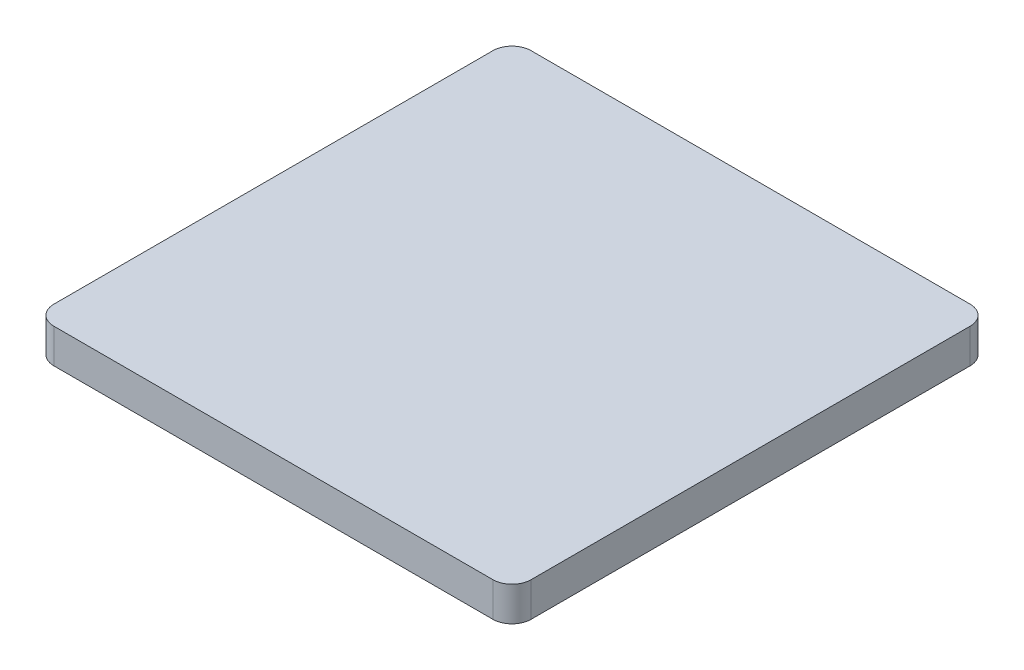
ISO-10303-21;
HEADER;
FILE_DESCRIPTION(('STEP AP214'),'2;1');
FILE_NAME('part.step','',(''),(''),'','','');
FILE_SCHEMA(('AUTOMOTIVE_DESIGN { 1 0 10303 214 1 1 1 1 }'));
ENDSEC;
DATA;
#1=APPLICATION_CONTEXT('core data for automotive mechanical design processes');
#2=APPLICATION_PROTOCOL_DEFINITION('international standard','automotive_design',2000,#1);
#3=PRODUCT_CONTEXT('',#1,'mechanical');
#4=PRODUCT('Part','Part','',(#3));
#5=PRODUCT_RELATED_PRODUCT_CATEGORY('part','',(#4));
#6=PRODUCT_DEFINITION_FORMATION('','',#4);
#7=PRODUCT_DEFINITION_CONTEXT('part definition',#1,'design');
#8=PRODUCT_DEFINITION('design','',#6,#7);
#9=PRODUCT_DEFINITION_SHAPE('','',#8);
#10=(LENGTH_UNIT() NAMED_UNIT(*) SI_UNIT(.MILLI.,.METRE.));
#11=(NAMED_UNIT(*) PLANE_ANGLE_UNIT() SI_UNIT($,.RADIAN.));
#12=(NAMED_UNIT(*) SI_UNIT($,.STERADIAN.) SOLID_ANGLE_UNIT());
#13=UNCERTAINTY_MEASURE_WITH_UNIT(LENGTH_MEASURE(1.E-05),#10,'distance_accuracy_value','');
#14=(GEOMETRIC_REPRESENTATION_CONTEXT(3) GLOBAL_UNCERTAINTY_ASSIGNED_CONTEXT((#13)) GLOBAL_UNIT_ASSIGNED_CONTEXT((#10,
#11,#12)) REPRESENTATION_CONTEXT('',''));
#15=CARTESIAN_POINT('',(0.,0.,0.));
#16=DIRECTION('',(0.,0.,1.));
#17=DIRECTION('',(1.,0.,0.));
#18=AXIS2_PLACEMENT_3D('',#15,#16,#17);
#19=CARTESIAN_POINT('',(-125.,18.,125.));
#20=DIRECTION('',(1.,0.,0.));
#21=DIRECTION('',(0.,0.,-1.));
#22=AXIS2_PLACEMENT_3D('',#19,#20,#21);
#23=PLANE('',#22);
#24=DIRECTION('',(0.,0.,1.));
#25=VECTOR('',#24,1.);
#26=CARTESIAN_POINT('',(-125.,18.,125.));
#27=LINE('',#26,#25);
#28=CARTESIAN_POINT('',(-125.,18.,-115.));
#29=VERTEX_POINT('',#28);
#30=CARTESIAN_POINT('',(-125.,18.,115.));
#31=VERTEX_POINT('',#30);
#32=EDGE_CURVE('E122',#29,#31,#27,.T.);
#33=ORIENTED_EDGE('',*,*,#32,.F.);
#34=DIRECTION('',(0.,-1.,0.));
#35=VECTOR('',#34,1.);
#36=CARTESIAN_POINT('',(-125.,18.,-115.));
#37=LINE('',#36,#35);
#38=CARTESIAN_POINT('',(-125.,0.,-115.));
#39=VERTEX_POINT('',#38);
#40=EDGE_CURVE('E107',#29,#39,#37,.T.);
#41=ORIENTED_EDGE('',*,*,#40,.T.);
#42=DIRECTION('',(0.,0.,1.));
#43=VECTOR('',#42,1.);
#44=CARTESIAN_POINT('',(-125.,0.,125.));
#45=LINE('',#44,#43);
#46=CARTESIAN_POINT('',(-125.,0.,115.));
#47=VERTEX_POINT('',#46);
#48=EDGE_CURVE('E119',#39,#47,#45,.T.);
#49=ORIENTED_EDGE('',*,*,#48,.T.);
#50=DIRECTION('',(0.,-1.,0.));
#51=VECTOR('',#50,1.);
#52=CARTESIAN_POINT('',(-125.,18.,115.));
#53=LINE('',#52,#51);
#54=EDGE_CURVE('E124',#47,#31,#53,.F.);
#55=ORIENTED_EDGE('',*,*,#54,.T.);
#56=EDGE_LOOP('',(#33,#41,#49,#55));
#57=FACE_BOUND('',#56,.T.);
#58=ADVANCED_FACE('F37',(#57),#23,.F.);
#59=CARTESIAN_POINT('',(-125.,18.,125.));
#60=DIRECTION('',(0.,0.,-1.));
#61=DIRECTION('',(-1.,0.,0.));
#62=AXIS2_PLACEMENT_3D('',#59,#60,#61);
#63=PLANE('',#62);
#64=DIRECTION('',(1.,0.,0.));
#65=VECTOR('',#64,1.);
#66=CARTESIAN_POINT('',(-125.,0.,125.));
#67=LINE('',#66,#65);
#68=CARTESIAN_POINT('',(-115.,0.,125.));
#69=VERTEX_POINT('',#68);
#70=CARTESIAN_POINT('',(115.,0.,125.));
#71=VERTEX_POINT('',#70);
#72=EDGE_CURVE('E128',#69,#71,#67,.T.);
#73=ORIENTED_EDGE('',*,*,#72,.T.);
#74=DIRECTION('',(0.,-1.,0.));
#75=VECTOR('',#74,1.);
#76=CARTESIAN_POINT('',(115.,18.,125.));
#77=LINE('',#76,#75);
#78=CARTESIAN_POINT('',(115.,18.,125.));
#79=VERTEX_POINT('',#78);
#80=EDGE_CURVE('E11',#71,#79,#77,.F.);
#81=ORIENTED_EDGE('',*,*,#80,.T.);
#82=DIRECTION('',(1.,0.,0.));
#83=VECTOR('',#82,1.);
#84=CARTESIAN_POINT('',(-125.,18.,125.));
#85=LINE('',#84,#83);
#86=CARTESIAN_POINT('',(-115.,18.,125.));
#87=VERTEX_POINT('',#86);
#88=EDGE_CURVE('E164',#87,#79,#85,.T.);
#89=ORIENTED_EDGE('',*,*,#88,.F.);
#90=DIRECTION('',(0.,-1.,0.));
#91=VECTOR('',#90,1.);
#92=CARTESIAN_POINT('',(-115.,18.,125.));
#93=LINE('',#92,#91);
#94=EDGE_CURVE('E45',#87,#69,#93,.T.);
#95=ORIENTED_EDGE('',*,*,#94,.T.);
#96=EDGE_LOOP('',(#73,#81,#89,#95));
#97=FACE_BOUND('',#96,.T.);
#98=ADVANCED_FACE('F162',(#97),#63,.F.);
#99=CARTESIAN_POINT('',(125.,18.,125.));
#100=DIRECTION('',(-1.,0.,0.));
#101=DIRECTION('',(0.,0.,1.));
#102=AXIS2_PLACEMENT_3D('',#99,#100,#101);
#103=PLANE('',#102);
#104=DIRECTION('',(0.,0.,-1.));
#105=VECTOR('',#104,1.);
#106=CARTESIAN_POINT('',(125.,0.,125.));
#107=LINE('',#106,#105);
#108=CARTESIAN_POINT('',(125.,0.,115.));
#109=VERTEX_POINT('',#108);
#110=CARTESIAN_POINT('',(125.,0.,-115.));
#111=VERTEX_POINT('',#110);
#112=EDGE_CURVE('E131',#109,#111,#107,.T.);
#113=ORIENTED_EDGE('',*,*,#112,.T.);
#114=DIRECTION('',(0.,-1.,0.));
#115=VECTOR('',#114,1.);
#116=CARTESIAN_POINT('',(125.,18.,-115.));
#117=LINE('',#116,#115);
#118=CARTESIAN_POINT('',(125.,18.,-115.));
#119=VERTEX_POINT('',#118);
#120=EDGE_CURVE('E52',#111,#119,#117,.F.);
#121=ORIENTED_EDGE('',*,*,#120,.T.);
#122=DIRECTION('',(0.,0.,-1.));
#123=VECTOR('',#122,1.);
#124=CARTESIAN_POINT('',(125.,18.,125.));
#125=LINE('',#124,#123);
#126=CARTESIAN_POINT('',(125.,18.,115.));
#127=VERTEX_POINT('',#126);
#128=EDGE_CURVE('E172',#127,#119,#125,.T.);
#129=ORIENTED_EDGE('',*,*,#128,.F.);
#130=DIRECTION('',(0.,-1.,0.));
#131=VECTOR('',#130,1.);
#132=CARTESIAN_POINT('',(125.,18.,115.));
#133=LINE('',#132,#131);
#134=EDGE_CURVE('E155',#127,#109,#133,.T.);
#135=ORIENTED_EDGE('',*,*,#134,.T.);
#136=EDGE_LOOP('',(#113,#121,#129,#135));
#137=FACE_BOUND('',#136,.T.);
#138=ADVANCED_FACE('F171',(#137),#103,.F.);
#139=CARTESIAN_POINT('',(-125.,18.,-125.));
#140=DIRECTION('',(0.,0.,1.));
#141=DIRECTION('',(1.,0.,0.));
#142=AXIS2_PLACEMENT_3D('',#139,#140,#141);
#143=PLANE('',#142);
#144=DIRECTION('',(-1.,0.,0.));
#145=VECTOR('',#144,1.);
#146=CARTESIAN_POINT('',(-125.,0.,-125.));
#147=LINE('',#146,#145);
#148=CARTESIAN_POINT('',(115.,0.,-125.));
#149=VERTEX_POINT('',#148);
#150=CARTESIAN_POINT('',(-115.,0.,-125.));
#151=VERTEX_POINT('',#150);
#152=EDGE_CURVE('E138',#149,#151,#147,.T.);
#153=ORIENTED_EDGE('',*,*,#152,.T.);
#154=DIRECTION('',(0.,-1.,0.));
#155=VECTOR('',#154,1.);
#156=CARTESIAN_POINT('',(-115.,18.,-125.));
#157=LINE('',#156,#155);
#158=CARTESIAN_POINT('',(-115.,18.,-125.));
#159=VERTEX_POINT('',#158);
#160=EDGE_CURVE('E108',#151,#159,#157,.F.);
#161=ORIENTED_EDGE('',*,*,#160,.T.);
#162=DIRECTION('',(-1.,0.,0.));
#163=VECTOR('',#162,1.);
#164=CARTESIAN_POINT('',(-125.,18.,-125.));
#165=LINE('',#164,#163);
#166=CARTESIAN_POINT('',(115.,18.,-125.));
#167=VERTEX_POINT('',#166);
#168=EDGE_CURVE('E134',#167,#159,#165,.T.);
#169=ORIENTED_EDGE('',*,*,#168,.F.);
#170=DIRECTION('',(0.,-1.,0.));
#171=VECTOR('',#170,1.);
#172=CARTESIAN_POINT('',(115.,18.,-125.));
#173=LINE('',#172,#171);
#174=EDGE_CURVE('E113',#167,#149,#173,.T.);
#175=ORIENTED_EDGE('',*,*,#174,.T.);
#176=EDGE_LOOP('',(#153,#161,#169,#175));
#177=FACE_BOUND('',#176,.T.);
#178=ADVANCED_FACE('F200',(#177),#143,.F.);
#179=CARTESIAN_POINT('',(0.,18.,0.));
#180=DIRECTION('',(0.,-1.,0.));
#181=DIRECTION('',(0.,0.,-1.));
#182=AXIS2_PLACEMENT_3D('',#179,#180,#181);
#183=PLANE('',#182);
#184=ORIENTED_EDGE('',*,*,#168,.T.);
#185=CARTESIAN_POINT('',(-115.,18.,-115.));
#186=DIRECTION('',(0.,-1.,0.));
#187=DIRECTION('',(0.,0.,-1.));
#188=AXIS2_PLACEMENT_3D('',#185,#186,#187);
#189=CIRCLE('',#188,10.);
#190=EDGE_CURVE('E153',#159,#29,#189,.F.);
#191=ORIENTED_EDGE('',*,*,#190,.T.);
#192=ORIENTED_EDGE('',*,*,#32,.T.);
#193=CARTESIAN_POINT('',(-115.,18.,115.));
#194=DIRECTION('',(0.,-1.,0.));
#195=DIRECTION('',(0.,0.,-1.));
#196=AXIS2_PLACEMENT_3D('',#193,#194,#195);
#197=CIRCLE('',#196,10.);
#198=EDGE_CURVE('E148',#31,#87,#197,.F.);
#199=ORIENTED_EDGE('',*,*,#198,.T.);
#200=ORIENTED_EDGE('',*,*,#88,.T.);
#201=CARTESIAN_POINT('',(115.,18.,115.));
#202=DIRECTION('',(0.,-1.,0.));
#203=DIRECTION('',(0.,0.,-1.));
#204=AXIS2_PLACEMENT_3D('',#201,#202,#203);
#205=CIRCLE('',#204,10.);
#206=EDGE_CURVE('E59',#79,#127,#205,.F.);
#207=ORIENTED_EDGE('',*,*,#206,.T.);
#208=ORIENTED_EDGE('',*,*,#128,.T.);
#209=CARTESIAN_POINT('',(115.,18.,-115.));
#210=DIRECTION('',(0.,-1.,0.));
#211=DIRECTION('',(0.,0.,-1.));
#212=AXIS2_PLACEMENT_3D('',#209,#210,#211);
#213=CIRCLE('',#212,10.);
#214=EDGE_CURVE('E151',#119,#167,#213,.F.);
#215=ORIENTED_EDGE('',*,*,#214,.T.);
#216=EDGE_LOOP('',(#184,#191,#192,#199,#200,#207,#208,#215));
#217=FACE_BOUND('',#216,.T.);
#218=ADVANCED_FACE('F177',(#217),#183,.F.);
#219=CARTESIAN_POINT('',(0.,0.,0.));
#220=DIRECTION('',(0.,-1.,0.));
#221=DIRECTION('',(0.,0.,-1.));
#222=AXIS2_PLACEMENT_3D('',#219,#220,#221);
#223=PLANE('',#222);
#224=ORIENTED_EDGE('',*,*,#48,.F.);
#225=CARTESIAN_POINT('',(-115.,0.,-115.));
#226=DIRECTION('',(0.,-1.,0.));
#227=DIRECTION('',(0.,0.,-1.));
#228=AXIS2_PLACEMENT_3D('',#225,#226,#227);
#229=CIRCLE('',#228,10.);
#230=EDGE_CURVE('E103',#39,#151,#229,.T.);
#231=ORIENTED_EDGE('',*,*,#230,.T.);
#232=ORIENTED_EDGE('',*,*,#152,.F.);
#233=CARTESIAN_POINT('',(115.,0.,-115.));
#234=DIRECTION('',(0.,-1.,0.));
#235=DIRECTION('',(0.,0.,-1.));
#236=AXIS2_PLACEMENT_3D('',#233,#234,#235);
#237=CIRCLE('',#236,10.);
#238=EDGE_CURVE('E114',#149,#111,#237,.T.);
#239=ORIENTED_EDGE('',*,*,#238,.T.);
#240=ORIENTED_EDGE('',*,*,#112,.F.);
#241=CARTESIAN_POINT('',(115.,0.,115.));
#242=DIRECTION('',(0.,-1.,0.));
#243=DIRECTION('',(0.,0.,-1.));
#244=AXIS2_PLACEMENT_3D('',#241,#242,#243);
#245=CIRCLE('',#244,10.);
#246=EDGE_CURVE('E142',#109,#71,#245,.T.);
#247=ORIENTED_EDGE('',*,*,#246,.T.);
#248=ORIENTED_EDGE('',*,*,#72,.F.);
#249=CARTESIAN_POINT('',(-115.,0.,115.));
#250=DIRECTION('',(0.,-1.,0.));
#251=DIRECTION('',(0.,0.,-1.));
#252=AXIS2_PLACEMENT_3D('',#249,#250,#251);
#253=CIRCLE('',#252,10.);
#254=EDGE_CURVE('E123',#69,#47,#253,.T.);
#255=ORIENTED_EDGE('',*,*,#254,.T.);
#256=EDGE_LOOP('',(#224,#231,#232,#239,#240,#247,#248,#255));
#257=FACE_BOUND('',#256,.T.);
#258=ADVANCED_FACE('F126',(#257),#223,.T.);
#259=CARTESIAN_POINT('',(-115.,18.,-115.));
#260=DIRECTION('',(0.,-1.,0.));
#261=DIRECTION('',(0.,0.,-1.));
#262=AXIS2_PLACEMENT_3D('',#259,#260,#261);
#263=CYLINDRICAL_SURFACE('',#262,10.);
#264=ORIENTED_EDGE('',*,*,#190,.F.);
#265=ORIENTED_EDGE('',*,*,#160,.F.);
#266=ORIENTED_EDGE('',*,*,#230,.F.);
#267=ORIENTED_EDGE('',*,*,#40,.F.);
#268=EDGE_LOOP('',(#264,#265,#266,#267));
#269=FACE_BOUND('',#268,.T.);
#270=ADVANCED_FACE('F106',(#269),#263,.T.);
#271=CARTESIAN_POINT('',(115.,18.,-115.));
#272=DIRECTION('',(0.,-1.,0.));
#273=DIRECTION('',(0.,0.,-1.));
#274=AXIS2_PLACEMENT_3D('',#271,#272,#273);
#275=CYLINDRICAL_SURFACE('',#274,10.);
#276=ORIENTED_EDGE('',*,*,#214,.F.);
#277=ORIENTED_EDGE('',*,*,#120,.F.);
#278=ORIENTED_EDGE('',*,*,#238,.F.);
#279=ORIENTED_EDGE('',*,*,#174,.F.);
#280=EDGE_LOOP('',(#276,#277,#278,#279));
#281=FACE_BOUND('',#280,.T.);
#282=ADVANCED_FACE('F182',(#281),#275,.T.);
#283=CARTESIAN_POINT('',(115.,18.,115.));
#284=DIRECTION('',(0.,-1.,0.));
#285=DIRECTION('',(0.,0.,-1.));
#286=AXIS2_PLACEMENT_3D('',#283,#284,#285);
#287=CYLINDRICAL_SURFACE('',#286,10.);
#288=ORIENTED_EDGE('',*,*,#206,.F.);
#289=ORIENTED_EDGE('',*,*,#80,.F.);
#290=ORIENTED_EDGE('',*,*,#246,.F.);
#291=ORIENTED_EDGE('',*,*,#134,.F.);
#292=EDGE_LOOP('',(#288,#289,#290,#291));
#293=FACE_BOUND('',#292,.T.);
#294=ADVANCED_FACE('F170',(#293),#287,.T.);
#295=CARTESIAN_POINT('',(-115.,18.,115.));
#296=DIRECTION('',(0.,-1.,0.));
#297=DIRECTION('',(0.,0.,-1.));
#298=AXIS2_PLACEMENT_3D('',#295,#296,#297);
#299=CYLINDRICAL_SURFACE('',#298,10.);
#300=ORIENTED_EDGE('',*,*,#198,.F.);
#301=ORIENTED_EDGE('',*,*,#54,.F.);
#302=ORIENTED_EDGE('',*,*,#254,.F.);
#303=ORIENTED_EDGE('',*,*,#94,.F.);
#304=EDGE_LOOP('',(#300,#301,#302,#303));
#305=FACE_BOUND('',#304,.T.);
#306=ADVANCED_FACE('F39',(#305),#299,.T.);
#307=CLOSED_SHELL('',(#58,#98,#138,#178,#218,#258,#270,#282,#294,#306));
#308=MANIFOLD_SOLID_BREP('B2',#307);
#309=ADVANCED_BREP_SHAPE_REPRESENTATION('',(#18,#308),#14);
#310=SHAPE_DEFINITION_REPRESENTATION(#9,#309);
ENDSEC;
END-ISO-10303-21;
